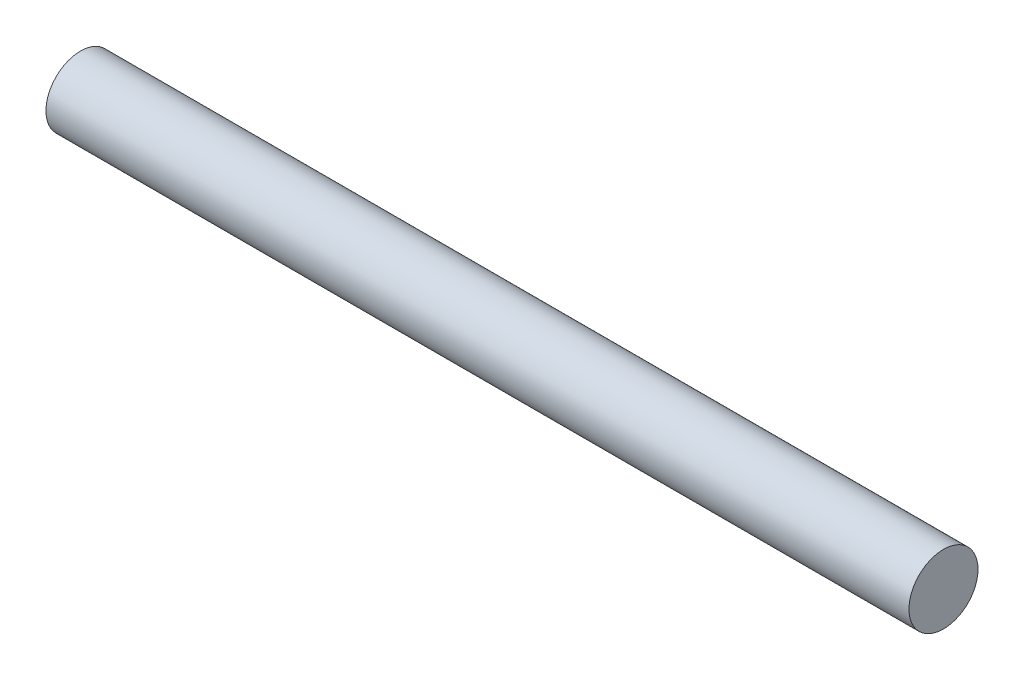
ISO-10303-21;
HEADER;
FILE_DESCRIPTION(('STEP AP214'),'2;1');
FILE_NAME('part.step','',(''),(''),'','','');
FILE_SCHEMA(('AUTOMOTIVE_DESIGN { 1 0 10303 214 1 1 1 1 }'));
ENDSEC;
DATA;
#1=APPLICATION_CONTEXT('core data for automotive mechanical design processes');
#2=APPLICATION_PROTOCOL_DEFINITION('international standard','automotive_design',2000,#1);
#3=PRODUCT_CONTEXT('',#1,'mechanical');
#4=PRODUCT('Part','Part','',(#3));
#5=PRODUCT_RELATED_PRODUCT_CATEGORY('part','',(#4));
#6=PRODUCT_DEFINITION_FORMATION('','',#4);
#7=PRODUCT_DEFINITION_CONTEXT('part definition',#1,'design');
#8=PRODUCT_DEFINITION('design','',#6,#7);
#9=PRODUCT_DEFINITION_SHAPE('','',#8);
#10=(LENGTH_UNIT() NAMED_UNIT(*) SI_UNIT(.MILLI.,.METRE.));
#11=(NAMED_UNIT(*) PLANE_ANGLE_UNIT() SI_UNIT($,.RADIAN.));
#12=(NAMED_UNIT(*) SI_UNIT($,.STERADIAN.) SOLID_ANGLE_UNIT());
#13=UNCERTAINTY_MEASURE_WITH_UNIT(LENGTH_MEASURE(1.E-05),#10,'distance_accuracy_value','');
#14=(GEOMETRIC_REPRESENTATION_CONTEXT(3) GLOBAL_UNCERTAINTY_ASSIGNED_CONTEXT((#13)) GLOBAL_UNIT_ASSIGNED_CONTEXT((#10,
#11,#12)) REPRESENTATION_CONTEXT('',''));
#15=CARTESIAN_POINT('',(0.,0.,0.));
#16=DIRECTION('',(0.,0.,1.));
#17=DIRECTION('',(1.,0.,0.));
#18=AXIS2_PLACEMENT_3D('',#15,#16,#17);
#19=CARTESIAN_POINT('',(100.,0.,0.));
#20=DIRECTION('',(-1.,0.,0.));
#21=DIRECTION('',(0.,0.,1.));
#22=AXIS2_PLACEMENT_3D('',#19,#20,#21);
#23=CYLINDRICAL_SURFACE('',#22,4.);
#24=CARTESIAN_POINT('',(100.,0.,0.));
#25=DIRECTION('',(1.,0.,0.));
#26=DIRECTION('',(0.,0.,-1.));
#27=AXIS2_PLACEMENT_3D('',#24,#25,#26);
#28=CIRCLE('',#27,4.);
#29=CARTESIAN_POINT('',(100.,0.,-4.));
#30=VERTEX_POINT('',#29);
#31=EDGE_CURVE('E10',#30,#30,#28,.T.);
#32=ORIENTED_EDGE('',*,*,#31,.F.);
#33=EDGE_LOOP('',(#32));
#34=FACE_BOUND('',#33,.T.);
#35=CARTESIAN_POINT('',(0.,0.,0.));
#36=DIRECTION('',(1.,0.,0.));
#37=DIRECTION('',(0.,0.,-1.));
#38=AXIS2_PLACEMENT_3D('',#35,#36,#37);
#39=CIRCLE('',#38,4.);
#40=CARTESIAN_POINT('',(0.,0.,-4.));
#41=VERTEX_POINT('',#40);
#42=EDGE_CURVE('E37',#41,#41,#39,.T.);
#43=ORIENTED_EDGE('',*,*,#42,.T.);
#44=EDGE_LOOP('',(#43));
#45=FACE_BOUND('',#44,.T.);
#46=ADVANCED_FACE('F34',(#34,#45),#23,.T.);
#47=CARTESIAN_POINT('',(100.,0.,0.));
#48=DIRECTION('',(1.,0.,0.));
#49=DIRECTION('',(0.,0.,-1.));
#50=AXIS2_PLACEMENT_3D('',#47,#48,#49);
#51=PLANE('',#50);
#52=ORIENTED_EDGE('',*,*,#31,.T.);
#53=EDGE_LOOP('',(#52));
#54=FACE_BOUND('',#53,.T.);
#55=ADVANCED_FACE('F49',(#54),#51,.T.);
#56=CARTESIAN_POINT('',(0.,0.,0.));
#57=DIRECTION('',(1.,0.,0.));
#58=DIRECTION('',(0.,0.,-1.));
#59=AXIS2_PLACEMENT_3D('',#56,#57,#58);
#60=PLANE('',#59);
#61=ORIENTED_EDGE('',*,*,#42,.F.);
#62=EDGE_LOOP('',(#61));
#63=FACE_BOUND('',#62,.T.);
#64=ADVANCED_FACE('F47',(#63),#60,.F.);
#65=CLOSED_SHELL('',(#46,#55,#64));
#66=MANIFOLD_SOLID_BREP('B2',#65);
#67=ADVANCED_BREP_SHAPE_REPRESENTATION('',(#18,#66),#14);
#68=SHAPE_DEFINITION_REPRESENTATION(#9,#67);
ENDSEC;
END-ISO-10303-21;
